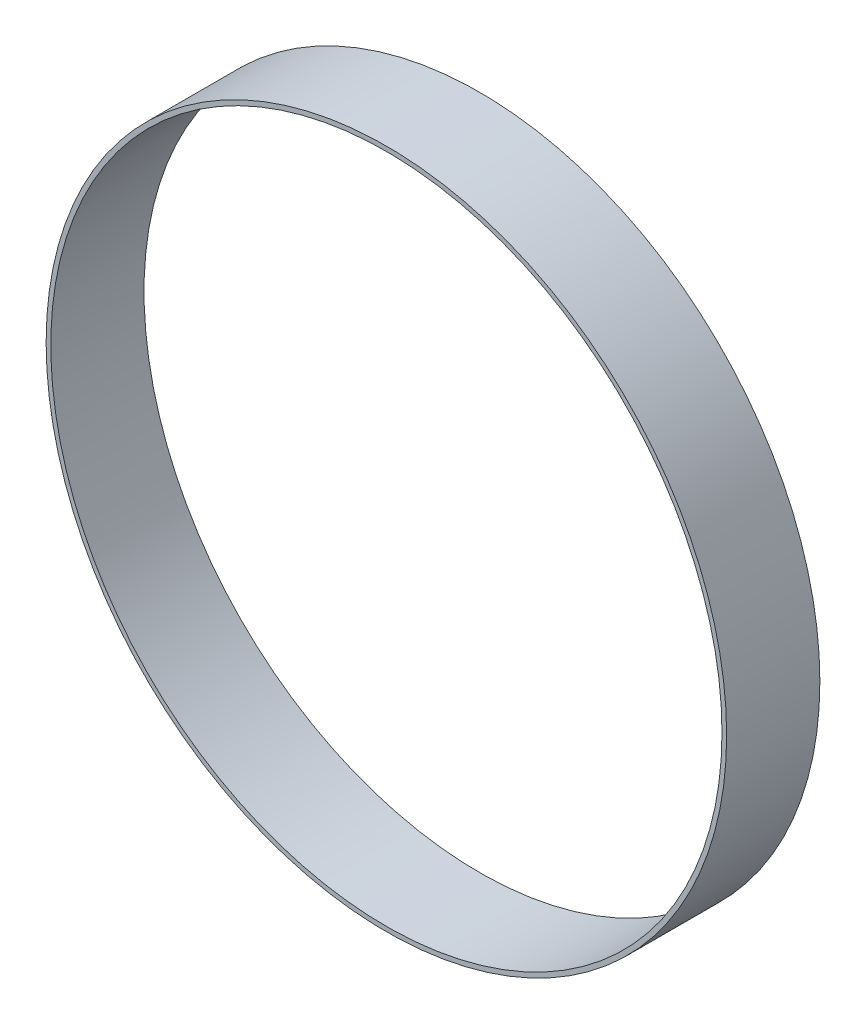
ISO-10303-21;
HEADER;
FILE_DESCRIPTION(('STEP AP214'),'2;1');
FILE_NAME('part.step','',(''),(''),'','','');
FILE_SCHEMA(('AUTOMOTIVE_DESIGN { 1 0 10303 214 1 1 1 1 }'));
ENDSEC;
DATA;
#1=APPLICATION_CONTEXT('core data for automotive mechanical design processes');
#2=APPLICATION_PROTOCOL_DEFINITION('international standard','automotive_design',2000,#1);
#3=PRODUCT_CONTEXT('',#1,'mechanical');
#4=PRODUCT('Part','Part','',(#3));
#5=PRODUCT_RELATED_PRODUCT_CATEGORY('part','',(#4));
#6=PRODUCT_DEFINITION_FORMATION('','',#4);
#7=PRODUCT_DEFINITION_CONTEXT('part definition',#1,'design');
#8=PRODUCT_DEFINITION('design','',#6,#7);
#9=PRODUCT_DEFINITION_SHAPE('','',#8);
#10=(LENGTH_UNIT() NAMED_UNIT(*) SI_UNIT(.MILLI.,.METRE.));
#11=(NAMED_UNIT(*) PLANE_ANGLE_UNIT() SI_UNIT($,.RADIAN.));
#12=(NAMED_UNIT(*) SI_UNIT($,.STERADIAN.) SOLID_ANGLE_UNIT());
#13=UNCERTAINTY_MEASURE_WITH_UNIT(LENGTH_MEASURE(1.E-05),#10,'distance_accuracy_value','');
#14=(GEOMETRIC_REPRESENTATION_CONTEXT(3) GLOBAL_UNCERTAINTY_ASSIGNED_CONTEXT((#13)) GLOBAL_UNIT_ASSIGNED_CONTEXT((#10,
#11,#12)) REPRESENTATION_CONTEXT('',''));
#15=CARTESIAN_POINT('',(0.,0.,0.));
#16=DIRECTION('',(0.,0.,1.));
#17=DIRECTION('',(1.,0.,0.));
#18=AXIS2_PLACEMENT_3D('',#15,#16,#17);
#19=CARTESIAN_POINT('',(0.,0.,20.));
#20=DIRECTION('',(0.,0.,1.));
#21=DIRECTION('',(1.,0.,0.));
#22=AXIS2_PLACEMENT_3D('',#19,#20,#21);
#23=PLANE('',#22);
#24=CARTESIAN_POINT('',(0.,0.,20.));
#25=DIRECTION('',(0.,0.,1.));
#26=DIRECTION('',(1.,0.,0.));
#27=AXIS2_PLACEMENT_3D('',#24,#25,#26);
#28=CIRCLE('',#27,73.);
#29=CARTESIAN_POINT('',(73.,0.,20.));
#30=VERTEX_POINT('',#29);
#31=EDGE_CURVE('E10',#30,#30,#28,.T.);
#32=ORIENTED_EDGE('',*,*,#31,.T.);
#33=EDGE_LOOP('',(#32));
#34=FACE_BOUND('',#33,.T.);
#35=CARTESIAN_POINT('',(0.,0.,20.));
#36=DIRECTION('',(0.,0.,1.));
#37=DIRECTION('',(1.,0.,0.));
#38=AXIS2_PLACEMENT_3D('',#35,#36,#37);
#39=CIRCLE('',#38,72.);
#40=CARTESIAN_POINT('',(72.,0.,20.));
#41=VERTEX_POINT('',#40);
#42=EDGE_CURVE('E42',#41,#41,#39,.T.);
#43=ORIENTED_EDGE('',*,*,#42,.F.);
#44=EDGE_LOOP('',(#43));
#45=FACE_BOUND('',#44,.T.);
#46=ADVANCED_FACE('F31',(#34,#45),#23,.T.);
#47=CARTESIAN_POINT('',(0.,0.,0.));
#48=DIRECTION('',(0.,0.,1.));
#49=DIRECTION('',(1.,0.,0.));
#50=AXIS2_PLACEMENT_3D('',#47,#48,#49);
#51=PLANE('',#50);
#52=CARTESIAN_POINT('',(0.,0.,0.));
#53=DIRECTION('',(0.,0.,1.));
#54=DIRECTION('',(1.,0.,0.));
#55=AXIS2_PLACEMENT_3D('',#52,#53,#54);
#56=CIRCLE('',#55,73.);
#57=CARTESIAN_POINT('',(73.,0.,0.));
#58=VERTEX_POINT('',#57);
#59=EDGE_CURVE('E35',#58,#58,#56,.T.);
#60=ORIENTED_EDGE('',*,*,#59,.F.);
#61=EDGE_LOOP('',(#60));
#62=FACE_BOUND('',#61,.T.);
#63=CARTESIAN_POINT('',(0.,0.,0.));
#64=DIRECTION('',(0.,0.,1.));
#65=DIRECTION('',(1.,0.,0.));
#66=AXIS2_PLACEMENT_3D('',#63,#64,#65);
#67=CIRCLE('',#66,72.);
#68=CARTESIAN_POINT('',(72.,0.,0.));
#69=VERTEX_POINT('',#68);
#70=EDGE_CURVE('E44',#69,#69,#67,.T.);
#71=ORIENTED_EDGE('',*,*,#70,.T.);
#72=EDGE_LOOP('',(#71));
#73=FACE_BOUND('',#72,.T.);
#74=ADVANCED_FACE('F54',(#62,#73),#51,.F.);
#75=CARTESIAN_POINT('',(0.,0.,20.));
#76=DIRECTION('',(0.,0.,-1.));
#77=DIRECTION('',(-1.,0.,0.));
#78=AXIS2_PLACEMENT_3D('',#75,#76,#77);
#79=CYLINDRICAL_SURFACE('',#78,73.);
#80=ORIENTED_EDGE('',*,*,#31,.F.);
#81=EDGE_LOOP('',(#80));
#82=FACE_BOUND('',#81,.T.);
#83=ORIENTED_EDGE('',*,*,#59,.T.);
#84=EDGE_LOOP('',(#83));
#85=FACE_BOUND('',#84,.T.);
#86=ADVANCED_FACE('F33',(#82,#85),#79,.T.);
#87=CARTESIAN_POINT('',(0.,0.,20.));
#88=DIRECTION('',(0.,0.,-1.));
#89=DIRECTION('',(-1.,0.,0.));
#90=AXIS2_PLACEMENT_3D('',#87,#88,#89);
#91=CYLINDRICAL_SURFACE('',#90,72.);
#92=ORIENTED_EDGE('',*,*,#42,.T.);
#93=EDGE_LOOP('',(#92));
#94=FACE_BOUND('',#93,.T.);
#95=ORIENTED_EDGE('',*,*,#70,.F.);
#96=EDGE_LOOP('',(#95));
#97=FACE_BOUND('',#96,.T.);
#98=ADVANCED_FACE('F50',(#94,#97),#91,.F.);
#99=CLOSED_SHELL('',(#46,#74,#86,#98));
#100=MANIFOLD_SOLID_BREP('B2',#99);
#101=ADVANCED_BREP_SHAPE_REPRESENTATION('',(#18,#100),#14);
#102=SHAPE_DEFINITION_REPRESENTATION(#9,#101);
ENDSEC;
END-ISO-10303-21;
